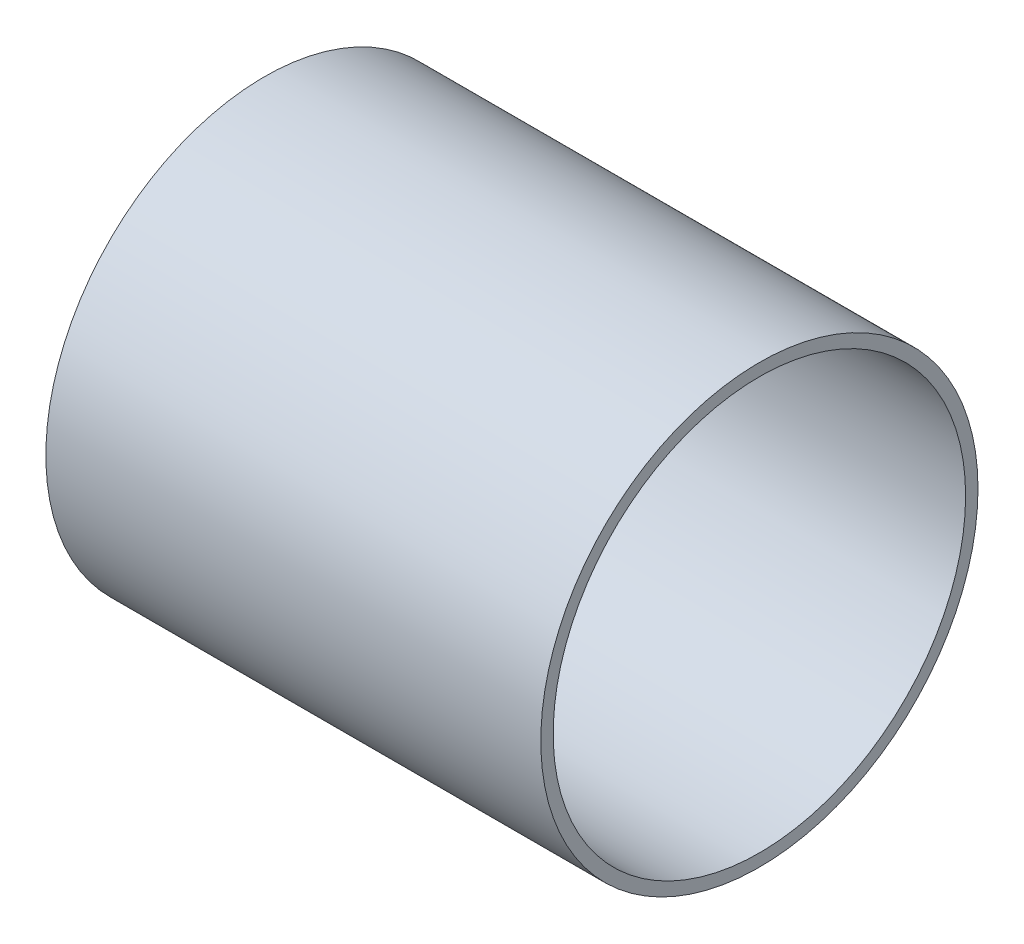
ISO-10303-21;
HEADER;
FILE_DESCRIPTION(('STEP AP214'),'2;1');
FILE_NAME('part.step','',(''),(''),'','','');
FILE_SCHEMA(('AUTOMOTIVE_DESIGN { 1 0 10303 214 1 1 1 1 }'));
ENDSEC;
DATA;
#1=APPLICATION_CONTEXT('core data for automotive mechanical design processes');
#2=APPLICATION_PROTOCOL_DEFINITION('international standard','automotive_design',2000,#1);
#3=PRODUCT_CONTEXT('',#1,'mechanical');
#4=PRODUCT('Part','Part','',(#3));
#5=PRODUCT_RELATED_PRODUCT_CATEGORY('part','',(#4));
#6=PRODUCT_DEFINITION_FORMATION('','',#4);
#7=PRODUCT_DEFINITION_CONTEXT('part definition',#1,'design');
#8=PRODUCT_DEFINITION('design','',#6,#7);
#9=PRODUCT_DEFINITION_SHAPE('','',#8);
#10=(LENGTH_UNIT() NAMED_UNIT(*) SI_UNIT(.MILLI.,.METRE.));
#11=(NAMED_UNIT(*) PLANE_ANGLE_UNIT() SI_UNIT($,.RADIAN.));
#12=(NAMED_UNIT(*) SI_UNIT($,.STERADIAN.) SOLID_ANGLE_UNIT());
#13=UNCERTAINTY_MEASURE_WITH_UNIT(LENGTH_MEASURE(1.E-05),#10,'distance_accuracy_value','');
#14=(GEOMETRIC_REPRESENTATION_CONTEXT(3) GLOBAL_UNCERTAINTY_ASSIGNED_CONTEXT((#13)) GLOBAL_UNIT_ASSIGNED_CONTEXT((#10,
#11,#12)) REPRESENTATION_CONTEXT('',''));
#15=CARTESIAN_POINT('',(0.,0.,0.));
#16=DIRECTION('',(0.,0.,1.));
#17=DIRECTION('',(1.,0.,0.));
#18=AXIS2_PLACEMENT_3D('',#15,#16,#17);
#19=CARTESIAN_POINT('',(0.,75.,0.));
#20=DIRECTION('',(-1.,0.,0.));
#21=DIRECTION('',(0.,0.,1.));
#22=AXIS2_PLACEMENT_3D('',#19,#20,#21);
#23=PLANE('',#22);
#24=CARTESIAN_POINT('',(0.,0.,0.));
#25=DIRECTION('',(1.,0.,0.));
#26=DIRECTION('',(0.,0.,-1.));
#27=AXIS2_PLACEMENT_3D('',#24,#25,#26);
#28=CIRCLE('',#27,75.);
#29=CARTESIAN_POINT('',(0.,0.,-75.));
#30=VERTEX_POINT('',#29);
#31=EDGE_CURVE('E47',#30,#30,#28,.T.);
#32=ORIENTED_EDGE('',*,*,#31,.T.);
#33=EDGE_LOOP('',(#32));
#34=FACE_BOUND('',#33,.T.);
#35=CARTESIAN_POINT('',(0.,0.,0.));
#36=DIRECTION('',(1.,0.,0.));
#37=DIRECTION('',(0.,0.,-1.));
#38=AXIS2_PLACEMENT_3D('',#35,#36,#37);
#39=CIRCLE('',#38,79.5);
#40=CARTESIAN_POINT('',(0.,0.,-79.5));
#41=VERTEX_POINT('',#40);
#42=EDGE_CURVE('E11',#41,#41,#39,.T.);
#43=ORIENTED_EDGE('',*,*,#42,.F.);
#44=EDGE_LOOP('',(#43));
#45=FACE_BOUND('',#44,.T.);
#46=ADVANCED_FACE('F32',(#34,#45),#23,.T.);
#47=CARTESIAN_POINT('',(0.,0.,0.));
#48=DIRECTION('',(1.,0.,0.));
#49=DIRECTION('',(0.,0.,-1.));
#50=AXIS2_PLACEMENT_3D('',#47,#48,#49);
#51=CYLINDRICAL_SURFACE('',#50,79.5);
#52=ORIENTED_EDGE('',*,*,#42,.T.);
#53=EDGE_LOOP('',(#52));
#54=FACE_BOUND('',#53,.T.);
#55=CARTESIAN_POINT('',(180.,0.,0.));
#56=DIRECTION('',(1.,0.,0.));
#57=DIRECTION('',(0.,0.,-1.));
#58=AXIS2_PLACEMENT_3D('',#55,#56,#57);
#59=CIRCLE('',#58,79.5);
#60=CARTESIAN_POINT('',(180.,0.,-79.5));
#61=VERTEX_POINT('',#60);
#62=EDGE_CURVE('E39',#61,#61,#59,.T.);
#63=ORIENTED_EDGE('',*,*,#62,.F.);
#64=EDGE_LOOP('',(#63));
#65=FACE_BOUND('',#64,.T.);
#66=ADVANCED_FACE('F68',(#54,#65),#51,.T.);
#67=CARTESIAN_POINT('',(180.,75.,0.));
#68=DIRECTION('',(1.,0.,0.));
#69=DIRECTION('',(0.,0.,-1.));
#70=AXIS2_PLACEMENT_3D('',#67,#68,#69);
#71=PLANE('',#70);
#72=ORIENTED_EDGE('',*,*,#62,.T.);
#73=EDGE_LOOP('',(#72));
#74=FACE_BOUND('',#73,.T.);
#75=CARTESIAN_POINT('',(180.,0.,0.));
#76=DIRECTION('',(1.,0.,0.));
#77=DIRECTION('',(0.,0.,-1.));
#78=AXIS2_PLACEMENT_3D('',#75,#76,#77);
#79=CIRCLE('',#78,75.);
#80=CARTESIAN_POINT('',(180.,0.,-75.));
#81=VERTEX_POINT('',#80);
#82=EDGE_CURVE('E43',#81,#81,#79,.T.);
#83=ORIENTED_EDGE('',*,*,#82,.F.);
#84=EDGE_LOOP('',(#83));
#85=FACE_BOUND('',#84,.T.);
#86=ADVANCED_FACE('F62',(#74,#85),#71,.T.);
#87=CARTESIAN_POINT('',(0.,0.,0.));
#88=DIRECTION('',(1.,0.,0.));
#89=DIRECTION('',(0.,0.,-1.));
#90=AXIS2_PLACEMENT_3D('',#87,#88,#89);
#91=CYLINDRICAL_SURFACE('',#90,75.);
#92=ORIENTED_EDGE('',*,*,#82,.T.);
#93=EDGE_LOOP('',(#92));
#94=FACE_BOUND('',#93,.T.);
#95=ORIENTED_EDGE('',*,*,#31,.F.);
#96=EDGE_LOOP('',(#95));
#97=FACE_BOUND('',#96,.T.);
#98=ADVANCED_FACE('F60',(#94,#97),#91,.F.);
#99=CLOSED_SHELL('',(#46,#66,#86,#98));
#100=MANIFOLD_SOLID_BREP('B2',#99);
#101=ADVANCED_BREP_SHAPE_REPRESENTATION('',(#18,#100),#14);
#102=SHAPE_DEFINITION_REPRESENTATION(#9,#101);
ENDSEC;
END-ISO-10303-21;
